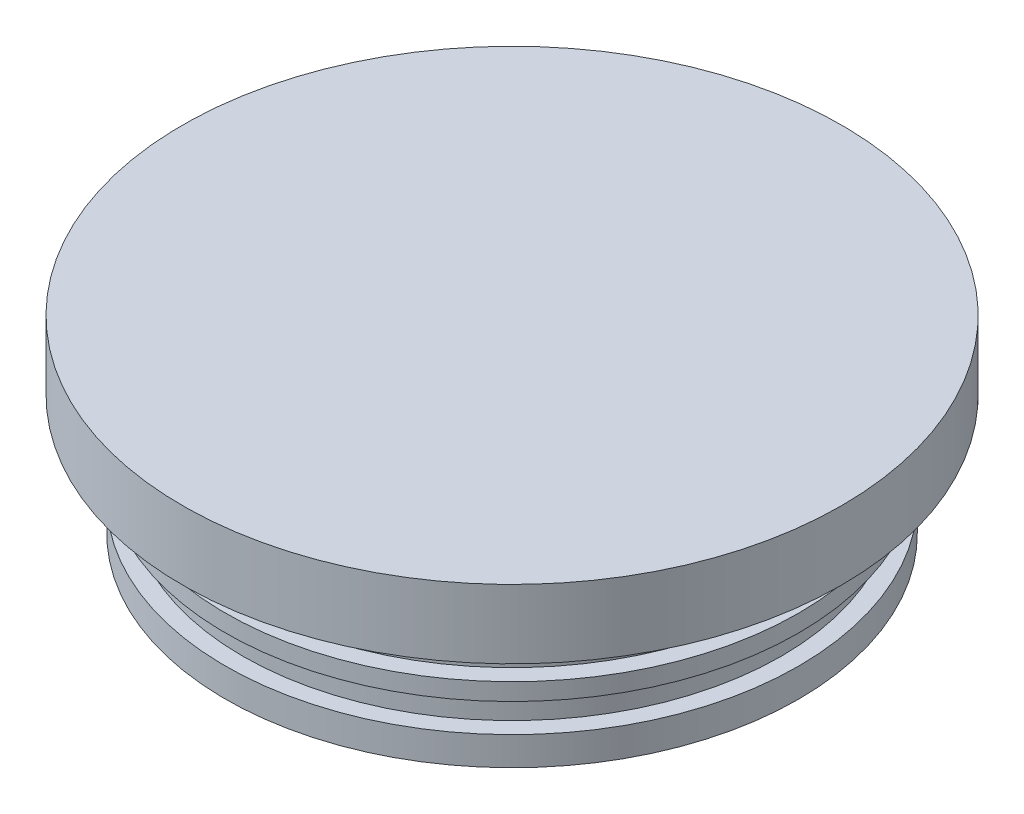
ISO-10303-21;
HEADER;
FILE_DESCRIPTION(('STEP AP214'),'2;1');
FILE_NAME('part.step','',(''),(''),'','','');
FILE_SCHEMA(('AUTOMOTIVE_DESIGN { 1 0 10303 214 1 1 1 1 }'));
ENDSEC;
DATA;
#1=APPLICATION_CONTEXT('core data for automotive mechanical design processes');
#2=APPLICATION_PROTOCOL_DEFINITION('international standard','automotive_design',2000,#1);
#3=PRODUCT_CONTEXT('',#1,'mechanical');
#4=PRODUCT('Part','Part','',(#3));
#5=PRODUCT_RELATED_PRODUCT_CATEGORY('part','',(#4));
#6=PRODUCT_DEFINITION_FORMATION('','',#4);
#7=PRODUCT_DEFINITION_CONTEXT('part definition',#1,'design');
#8=PRODUCT_DEFINITION('design','',#6,#7);
#9=PRODUCT_DEFINITION_SHAPE('','',#8);
#10=(LENGTH_UNIT() NAMED_UNIT(*) SI_UNIT(.MILLI.,.METRE.));
#11=(NAMED_UNIT(*) PLANE_ANGLE_UNIT() SI_UNIT($,.RADIAN.));
#12=(NAMED_UNIT(*) SI_UNIT($,.STERADIAN.) SOLID_ANGLE_UNIT());
#13=UNCERTAINTY_MEASURE_WITH_UNIT(LENGTH_MEASURE(1.E-05),#10,'distance_accuracy_value','');
#14=(GEOMETRIC_REPRESENTATION_CONTEXT(3) GLOBAL_UNCERTAINTY_ASSIGNED_CONTEXT((#13)) GLOBAL_UNIT_ASSIGNED_CONTEXT((#10,
#11,#12)) REPRESENTATION_CONTEXT('',''));
#15=CARTESIAN_POINT('',(0.,0.,0.));
#16=DIRECTION('',(0.,0.,1.));
#17=DIRECTION('',(1.,0.,0.));
#18=AXIS2_PLACEMENT_3D('',#15,#16,#17);
#19=CARTESIAN_POINT('',(0.,0.,0.));
#20=DIRECTION('',(0.,-1.,0.));
#21=DIRECTION('',(1.,0.,0.));
#22=AXIS2_PLACEMENT_3D('',#19,#20,#21);
#23=PLANE('',#22);
#24=CARTESIAN_POINT('',(0.,0.,0.));
#25=DIRECTION('',(0.,-1.,0.));
#26=DIRECTION('',(1.,0.,0.));
#27=AXIS2_PLACEMENT_3D('',#24,#25,#26);
#28=CIRCLE('',#27,45.);
#29=CARTESIAN_POINT('',(45.,0.,0.));
#30=VERTEX_POINT('',#29);
#31=EDGE_CURVE('E10',#30,#30,#28,.T.);
#32=ORIENTED_EDGE('',*,*,#31,.T.);
#33=EDGE_LOOP('',(#32));
#34=FACE_BOUND('',#33,.T.);
#35=ADVANCED_FACE('F30',(#34),#23,.T.);
#36=CARTESIAN_POINT('',(0.,0.,0.));
#37=DIRECTION('',(0.,-1.,0.));
#38=DIRECTION('',(1.,0.,0.));
#39=AXIS2_PLACEMENT_3D('',#36,#37,#38);
#40=CYLINDRICAL_SURFACE('',#39,45.);
#41=CARTESIAN_POINT('',(0.,-27.,0.));
#42=DIRECTION('',(0.,-1.,0.));
#43=DIRECTION('',(1.,0.,0.));
#44=AXIS2_PLACEMENT_3D('',#41,#42,#43);
#45=CIRCLE('',#44,45.);
#46=CARTESIAN_POINT('',(45.,-27.,0.));
#47=VERTEX_POINT('',#46);
#48=EDGE_CURVE('E36',#47,#47,#45,.T.);
#49=ORIENTED_EDGE('',*,*,#48,.T.);
#50=EDGE_LOOP('',(#49));
#51=FACE_BOUND('',#50,.T.);
#52=ORIENTED_EDGE('',*,*,#31,.F.);
#53=EDGE_LOOP('',(#52));
#54=FACE_BOUND('',#53,.T.);
#55=ADVANCED_FACE('F92',(#51,#54),#40,.F.);
#56=CARTESIAN_POINT('',(45.,-27.,0.));
#57=DIRECTION('',(0.,-1.,0.));
#58=DIRECTION('',(1.,0.,0.));
#59=AXIS2_PLACEMENT_3D('',#56,#57,#58);
#60=PLANE('',#59);
#61=CARTESIAN_POINT('',(0.,-27.,0.));
#62=DIRECTION('',(0.,-1.,0.));
#63=DIRECTION('',(1.,0.,0.));
#64=AXIS2_PLACEMENT_3D('',#61,#62,#63);
#65=CIRCLE('',#64,50.);
#66=CARTESIAN_POINT('',(50.,-27.,0.));
#67=VERTEX_POINT('',#66);
#68=EDGE_CURVE('E40',#67,#67,#65,.T.);
#69=ORIENTED_EDGE('',*,*,#68,.T.);
#70=EDGE_LOOP('',(#69));
#71=FACE_BOUND('',#70,.T.);
#72=ORIENTED_EDGE('',*,*,#48,.F.);
#73=EDGE_LOOP('',(#72));
#74=FACE_BOUND('',#73,.T.);
#75=ADVANCED_FACE('F96',(#71,#74),#60,.T.);
#76=CARTESIAN_POINT('',(0.,0.,0.));
#77=DIRECTION('',(0.,-1.,0.));
#78=DIRECTION('',(1.,0.,0.));
#79=AXIS2_PLACEMENT_3D('',#76,#77,#78);
#80=CYLINDRICAL_SURFACE('',#79,50.);
#81=CARTESIAN_POINT('',(0.,-22.,0.));
#82=DIRECTION('',(0.,-1.,0.));
#83=DIRECTION('',(1.,0.,0.));
#84=AXIS2_PLACEMENT_3D('',#81,#82,#83);
#85=CIRCLE('',#84,50.);
#86=CARTESIAN_POINT('',(50.,-22.,0.));
#87=VERTEX_POINT('',#86);
#88=EDGE_CURVE('E44',#87,#87,#85,.T.);
#89=ORIENTED_EDGE('',*,*,#88,.T.);
#90=EDGE_LOOP('',(#89));
#91=FACE_BOUND('',#90,.T.);
#92=ORIENTED_EDGE('',*,*,#68,.F.);
#93=EDGE_LOOP('',(#92));
#94=FACE_BOUND('',#93,.T.);
#95=ADVANCED_FACE('F100',(#91,#94),#80,.T.);
#96=CARTESIAN_POINT('',(50.,-22.,0.));
#97=DIRECTION('',(0.,1.,0.));
#98=DIRECTION('',(-1.,0.,0.));
#99=AXIS2_PLACEMENT_3D('',#96,#97,#98);
#100=PLANE('',#99);
#101=CARTESIAN_POINT('',(0.,-22.,0.));
#102=DIRECTION('',(0.,-1.,0.));
#103=DIRECTION('',(1.,0.,0.));
#104=AXIS2_PLACEMENT_3D('',#101,#102,#103);
#105=CIRCLE('',#104,47.);
#106=CARTESIAN_POINT('',(47.,-22.,0.));
#107=VERTEX_POINT('',#106);
#108=EDGE_CURVE('E49',#107,#107,#105,.T.);
#109=ORIENTED_EDGE('',*,*,#108,.T.);
#110=EDGE_LOOP('',(#109));
#111=FACE_BOUND('',#110,.T.);
#112=ORIENTED_EDGE('',*,*,#88,.F.);
#113=EDGE_LOOP('',(#112));
#114=FACE_BOUND('',#113,.T.);
#115=ADVANCED_FACE('F107',(#111,#114),#100,.T.);
#116=CARTESIAN_POINT('',(0.,0.,0.));
#117=DIRECTION('',(0.,-1.,0.));
#118=DIRECTION('',(1.,0.,0.));
#119=AXIS2_PLACEMENT_3D('',#116,#117,#118);
#120=CYLINDRICAL_SURFACE('',#119,47.);
#121=CARTESIAN_POINT('',(0.,-17.,0.));
#122=DIRECTION('',(0.,-1.,0.));
#123=DIRECTION('',(1.,0.,0.));
#124=AXIS2_PLACEMENT_3D('',#121,#122,#123);
#125=CIRCLE('',#124,47.);
#126=CARTESIAN_POINT('',(47.,-17.,0.));
#127=VERTEX_POINT('',#126);
#128=EDGE_CURVE('E52',#127,#127,#125,.T.);
#129=ORIENTED_EDGE('',*,*,#128,.T.);
#130=EDGE_LOOP('',(#129));
#131=FACE_BOUND('',#130,.T.);
#132=ORIENTED_EDGE('',*,*,#108,.F.);
#133=EDGE_LOOP('',(#132));
#134=FACE_BOUND('',#133,.T.);
#135=ADVANCED_FACE('F111',(#131,#134),#120,.T.);
#136=CARTESIAN_POINT('',(47.,-17.,0.));
#137=DIRECTION('',(0.,-1.,0.));
#138=DIRECTION('',(1.,0.,0.));
#139=AXIS2_PLACEMENT_3D('',#136,#137,#138);
#140=PLANE('',#139);
#141=CARTESIAN_POINT('',(0.,-17.,0.));
#142=DIRECTION('',(0.,-1.,0.));
#143=DIRECTION('',(1.,0.,0.));
#144=AXIS2_PLACEMENT_3D('',#141,#142,#143);
#145=CIRCLE('',#144,50.);
#146=CARTESIAN_POINT('',(50.,-17.,0.));
#147=VERTEX_POINT('',#146);
#148=EDGE_CURVE('E55',#147,#147,#145,.T.);
#149=ORIENTED_EDGE('',*,*,#148,.T.);
#150=EDGE_LOOP('',(#149));
#151=FACE_BOUND('',#150,.T.);
#152=ORIENTED_EDGE('',*,*,#128,.F.);
#153=EDGE_LOOP('',(#152));
#154=FACE_BOUND('',#153,.T.);
#155=ADVANCED_FACE('F115',(#151,#154),#140,.T.);
#156=CARTESIAN_POINT('',(0.,0.,0.));
#157=DIRECTION('',(0.,-1.,0.));
#158=DIRECTION('',(1.,0.,0.));
#159=AXIS2_PLACEMENT_3D('',#156,#157,#158);
#160=CYLINDRICAL_SURFACE('',#159,50.);
#161=CARTESIAN_POINT('',(0.,-14.,0.));
#162=DIRECTION('',(0.,-1.,0.));
#163=DIRECTION('',(1.,0.,0.));
#164=AXIS2_PLACEMENT_3D('',#161,#162,#163);
#165=CIRCLE('',#164,50.);
#166=CARTESIAN_POINT('',(50.,-14.,0.));
#167=VERTEX_POINT('',#166);
#168=EDGE_CURVE('E58',#167,#167,#165,.T.);
#169=ORIENTED_EDGE('',*,*,#168,.T.);
#170=EDGE_LOOP('',(#169));
#171=FACE_BOUND('',#170,.T.);
#172=ORIENTED_EDGE('',*,*,#148,.F.);
#173=EDGE_LOOP('',(#172));
#174=FACE_BOUND('',#173,.T.);
#175=ADVANCED_FACE('F119',(#171,#174),#160,.T.);
#176=CARTESIAN_POINT('',(50.,-14.,0.));
#177=DIRECTION('',(0.,1.,0.));
#178=DIRECTION('',(-1.,0.,0.));
#179=AXIS2_PLACEMENT_3D('',#176,#177,#178);
#180=PLANE('',#179);
#181=CARTESIAN_POINT('',(0.,-14.,0.));
#182=DIRECTION('',(0.,-1.,0.));
#183=DIRECTION('',(1.,0.,0.));
#184=AXIS2_PLACEMENT_3D('',#181,#182,#183);
#185=CIRCLE('',#184,47.);
#186=CARTESIAN_POINT('',(47.,-14.,0.));
#187=VERTEX_POINT('',#186);
#188=EDGE_CURVE('E61',#187,#187,#185,.T.);
#189=ORIENTED_EDGE('',*,*,#188,.T.);
#190=EDGE_LOOP('',(#189));
#191=FACE_BOUND('',#190,.T.);
#192=ORIENTED_EDGE('',*,*,#168,.F.);
#193=EDGE_LOOP('',(#192));
#194=FACE_BOUND('',#193,.T.);
#195=ADVANCED_FACE('F123',(#191,#194),#180,.T.);
#196=CARTESIAN_POINT('',(0.,0.,0.));
#197=DIRECTION('',(0.,-1.,0.));
#198=DIRECTION('',(1.,0.,0.));
#199=AXIS2_PLACEMENT_3D('',#196,#197,#198);
#200=CYLINDRICAL_SURFACE('',#199,47.);
#201=CARTESIAN_POINT('',(0.,-9.,0.));
#202=DIRECTION('',(0.,-1.,0.));
#203=DIRECTION('',(1.,0.,0.));
#204=AXIS2_PLACEMENT_3D('',#201,#202,#203);
#205=CIRCLE('',#204,47.);
#206=CARTESIAN_POINT('',(47.,-8.99999999999999,0.));
#207=VERTEX_POINT('',#206);
#208=EDGE_CURVE('E64',#207,#207,#205,.T.);
#209=ORIENTED_EDGE('',*,*,#208,.T.);
#210=EDGE_LOOP('',(#209));
#211=FACE_BOUND('',#210,.T.);
#212=ORIENTED_EDGE('',*,*,#188,.F.);
#213=EDGE_LOOP('',(#212));
#214=FACE_BOUND('',#213,.T.);
#215=ADVANCED_FACE('F127',(#211,#214),#200,.T.);
#216=CARTESIAN_POINT('',(47.,-8.99999999999999,0.));
#217=DIRECTION('',(0.,-1.,0.));
#218=DIRECTION('',(1.,0.,0.));
#219=AXIS2_PLACEMENT_3D('',#216,#217,#218);
#220=PLANE('',#219);
#221=CARTESIAN_POINT('',(0.,-9.,0.));
#222=DIRECTION('',(0.,-1.,0.));
#223=DIRECTION('',(1.,0.,0.));
#224=AXIS2_PLACEMENT_3D('',#221,#222,#223);
#225=CIRCLE('',#224,50.);
#226=CARTESIAN_POINT('',(50.,-8.99999999999999,0.));
#227=VERTEX_POINT('',#226);
#228=EDGE_CURVE('E67',#227,#227,#225,.T.);
#229=ORIENTED_EDGE('',*,*,#228,.T.);
#230=EDGE_LOOP('',(#229));
#231=FACE_BOUND('',#230,.T.);
#232=ORIENTED_EDGE('',*,*,#208,.F.);
#233=EDGE_LOOP('',(#232));
#234=FACE_BOUND('',#233,.T.);
#235=ADVANCED_FACE('F131',(#231,#234),#220,.T.);
#236=CARTESIAN_POINT('',(0.,0.,0.));
#237=DIRECTION('',(0.,-1.,0.));
#238=DIRECTION('',(1.,0.,0.));
#239=AXIS2_PLACEMENT_3D('',#236,#237,#238);
#240=CYLINDRICAL_SURFACE('',#239,50.);
#241=CARTESIAN_POINT('',(0.,-6.,0.));
#242=DIRECTION('',(0.,-1.,0.));
#243=DIRECTION('',(1.,0.,0.));
#244=AXIS2_PLACEMENT_3D('',#241,#242,#243);
#245=CIRCLE('',#244,50.);
#246=CARTESIAN_POINT('',(50.,-5.99999999999999,0.));
#247=VERTEX_POINT('',#246);
#248=EDGE_CURVE('E70',#247,#247,#245,.T.);
#249=ORIENTED_EDGE('',*,*,#248,.T.);
#250=EDGE_LOOP('',(#249));
#251=FACE_BOUND('',#250,.T.);
#252=ORIENTED_EDGE('',*,*,#228,.F.);
#253=EDGE_LOOP('',(#252));
#254=FACE_BOUND('',#253,.T.);
#255=ADVANCED_FACE('F135',(#251,#254),#240,.T.);
#256=CARTESIAN_POINT('',(50.,-5.99999999999999,0.));
#257=DIRECTION('',(0.,-1.,0.));
#258=DIRECTION('',(1.,0.,0.));
#259=AXIS2_PLACEMENT_3D('',#256,#257,#258);
#260=PLANE('',#259);
#261=CARTESIAN_POINT('',(0.,-6.,0.));
#262=DIRECTION('',(0.,-1.,0.));
#263=DIRECTION('',(1.,0.,0.));
#264=AXIS2_PLACEMENT_3D('',#261,#262,#263);
#265=CIRCLE('',#264,57.5);
#266=CARTESIAN_POINT('',(57.5,-5.99999999999999,0.));
#267=VERTEX_POINT('',#266);
#268=EDGE_CURVE('E73',#267,#267,#265,.T.);
#269=ORIENTED_EDGE('',*,*,#268,.T.);
#270=EDGE_LOOP('',(#269));
#271=FACE_BOUND('',#270,.T.);
#272=ORIENTED_EDGE('',*,*,#248,.F.);
#273=EDGE_LOOP('',(#272));
#274=FACE_BOUND('',#273,.T.);
#275=ADVANCED_FACE('F89',(#271,#274),#260,.T.);
#276=CARTESIAN_POINT('',(0.,0.,0.));
#277=DIRECTION('',(0.,-1.,0.));
#278=DIRECTION('',(1.,0.,0.));
#279=AXIS2_PLACEMENT_3D('',#276,#277,#278);
#280=CYLINDRICAL_SURFACE('',#279,57.5);
#281=CARTESIAN_POINT('',(0.,6.,0.));
#282=DIRECTION('',(0.,-1.,0.));
#283=DIRECTION('',(1.,0.,0.));
#284=AXIS2_PLACEMENT_3D('',#281,#282,#283);
#285=CIRCLE('',#284,57.5);
#286=CARTESIAN_POINT('',(57.5,6.00000000000001,0.));
#287=VERTEX_POINT('',#286);
#288=EDGE_CURVE('E76',#287,#287,#285,.T.);
#289=ORIENTED_EDGE('',*,*,#288,.T.);
#290=EDGE_LOOP('',(#289));
#291=FACE_BOUND('',#290,.T.);
#292=ORIENTED_EDGE('',*,*,#268,.F.);
#293=EDGE_LOOP('',(#292));
#294=FACE_BOUND('',#293,.T.);
#295=ADVANCED_FACE('F80',(#291,#294),#280,.T.);
#296=CARTESIAN_POINT('',(57.5,6.00000000000001,0.));
#297=DIRECTION('',(0.,1.,0.));
#298=DIRECTION('',(-1.,0.,0.));
#299=AXIS2_PLACEMENT_3D('',#296,#297,#298);
#300=PLANE('',#299);
#301=ORIENTED_EDGE('',*,*,#288,.F.);
#302=EDGE_LOOP('',(#301));
#303=FACE_BOUND('',#302,.T.);
#304=ADVANCED_FACE('F83',(#303),#300,.T.);
#305=CLOSED_SHELL('',(#35,#55,#75,#95,#115,#135,#155,#175,#195,#215,#235,#255,#275,#295,#304));
#306=MANIFOLD_SOLID_BREP('B2',#305);
#307=ADVANCED_BREP_SHAPE_REPRESENTATION('',(#18,#306),#14);
#308=SHAPE_DEFINITION_REPRESENTATION(#9,#307);
ENDSEC;
END-ISO-10303-21;
